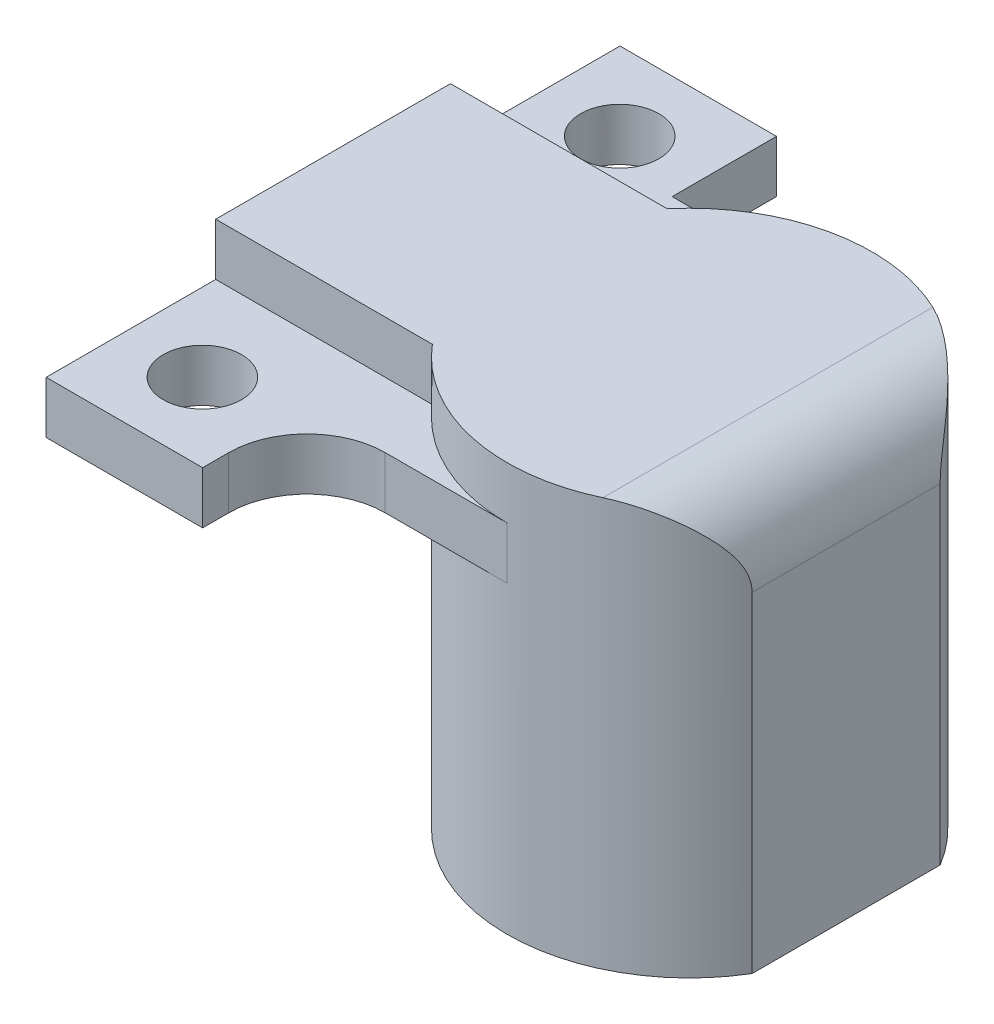
ISO-10303-21;
HEADER;
FILE_DESCRIPTION(('STEP AP214'),'2;1');
FILE_NAME('part.step','',(''),(''),'','','');
FILE_SCHEMA(('AUTOMOTIVE_DESIGN { 1 0 10303 214 1 1 1 1 }'));
ENDSEC;
DATA;
#1=APPLICATION_CONTEXT('core data for automotive mechanical design processes');
#2=APPLICATION_PROTOCOL_DEFINITION('international standard','automotive_design',2000,#1);
#3=PRODUCT_CONTEXT('',#1,'mechanical');
#4=PRODUCT('Part','Part','',(#3));
#5=PRODUCT_RELATED_PRODUCT_CATEGORY('part','',(#4));
#6=PRODUCT_DEFINITION_FORMATION('','',#4);
#7=PRODUCT_DEFINITION_CONTEXT('part definition',#1,'design');
#8=PRODUCT_DEFINITION('design','',#6,#7);
#9=PRODUCT_DEFINITION_SHAPE('','',#8);
#10=(LENGTH_UNIT() NAMED_UNIT(*) SI_UNIT(.MILLI.,.METRE.));
#11=(NAMED_UNIT(*) PLANE_ANGLE_UNIT() SI_UNIT($,.RADIAN.));
#12=(NAMED_UNIT(*) SI_UNIT($,.STERADIAN.) SOLID_ANGLE_UNIT());
#13=UNCERTAINTY_MEASURE_WITH_UNIT(LENGTH_MEASURE(1.E-05),#10,'distance_accuracy_value','');
#14=(GEOMETRIC_REPRESENTATION_CONTEXT(3) GLOBAL_UNCERTAINTY_ASSIGNED_CONTEXT((#13)) GLOBAL_UNIT_ASSIGNED_CONTEXT((#10,
#11,#12)) REPRESENTATION_CONTEXT('',''));
#15=CARTESIAN_POINT('',(0.,0.,0.));
#16=DIRECTION('',(0.,0.,1.));
#17=DIRECTION('',(1.,0.,0.));
#18=AXIS2_PLACEMENT_3D('',#15,#16,#17);
#19=CARTESIAN_POINT('',(0.,13.66,0.));
#20=DIRECTION('',(0.,1.,0.));
#21=DIRECTION('',(0.,0.,1.));
#22=AXIS2_PLACEMENT_3D('',#19,#20,#21);
#23=PLANE('',#22);
#24=CARTESIAN_POINT('',(-10.68,13.66,8.));
#25=DIRECTION('',(0.,1.,0.));
#26=DIRECTION('',(0.,0.,1.));
#27=AXIS2_PLACEMENT_3D('',#24,#25,#26);
#28=CIRCLE('',#27,1.5);
#29=CARTESIAN_POINT('',(-10.68,13.66,9.50000000000001));
#30=VERTEX_POINT('',#29);
#31=EDGE_CURVE('E191',#30,#30,#28,.T.);
#32=ORIENTED_EDGE('',*,*,#31,.F.);
#33=EDGE_LOOP('',(#32));
#34=FACE_BOUND('',#33,.T.);
#35=CARTESIAN_POINT('',(0.,13.66,0.));
#36=DIRECTION('',(0.,1.,0.));
#37=DIRECTION('',(0.,0.,1.));
#38=AXIS2_PLACEMENT_3D('',#35,#36,#37);
#39=CIRCLE('',#38,7.);
#40=CARTESIAN_POINT('',(-5.36190264738183,13.66,4.50000000000003));
#41=VERTEX_POINT('',#40);
#42=CARTESIAN_POINT('',(0.,13.66,7.));
#43=VERTEX_POINT('',#42);
#44=EDGE_CURVE('E489',#41,#43,#39,.T.);
#45=ORIENTED_EDGE('',*,*,#44,.F.);
#46=DIRECTION('',(1.,0.,0.));
#47=VECTOR('',#46,1.);
#48=CARTESIAN_POINT('',(-13.67,13.66,4.5));
#49=LINE('',#48,#47);
#50=CARTESIAN_POINT('',(-13.67,13.66,4.5));
#51=VERTEX_POINT('',#50);
#52=EDGE_CURVE('E552',#51,#41,#49,.T.);
#53=ORIENTED_EDGE('',*,*,#52,.F.);
#54=DIRECTION('',(0.,0.,-1.));
#55=VECTOR('',#54,1.);
#56=CARTESIAN_POINT('',(-13.67,13.66,0.));
#57=LINE('',#56,#55);
#58=CARTESIAN_POINT('',(-13.67,13.66,11.));
#59=VERTEX_POINT('',#58);
#60=EDGE_CURVE('E478',#59,#51,#57,.T.);
#61=ORIENTED_EDGE('',*,*,#60,.F.);
#62=DIRECTION('',(1.,0.,0.));
#63=VECTOR('',#62,1.);
#64=CARTESIAN_POINT('',(0.,13.66,11.));
#65=LINE('',#64,#63);
#66=CARTESIAN_POINT('',(-7.67,13.66,11.));
#67=VERTEX_POINT('',#66);
#68=EDGE_CURVE('E481',#59,#67,#65,.T.);
#69=ORIENTED_EDGE('',*,*,#68,.T.);
#70=DIRECTION('',(0.,0.,1.));
#71=VECTOR('',#70,1.);
#72=CARTESIAN_POINT('',(-7.67,13.66,0.));
#73=LINE('',#72,#71);
#74=CARTESIAN_POINT('',(-7.67,13.66,10.));
#75=VERTEX_POINT('',#74);
#76=EDGE_CURVE('E484',#75,#67,#73,.T.);
#77=ORIENTED_EDGE('',*,*,#76,.F.);
#78=CARTESIAN_POINT('',(-4.67,13.66,10.));
#79=DIRECTION('',(0.,1.,0.));
#80=DIRECTION('',(0.,0.,1.));
#81=AXIS2_PLACEMENT_3D('',#78,#79,#80);
#82=CIRCLE('',#81,3.);
#83=CARTESIAN_POINT('',(-4.67,13.66,7.));
#84=VERTEX_POINT('',#83);
#85=EDGE_CURVE('E201',#84,#75,#82,.T.);
#86=ORIENTED_EDGE('',*,*,#85,.F.);
#87=DIRECTION('',(1.,0.,0.));
#88=VECTOR('',#87,1.);
#89=CARTESIAN_POINT('',(0.,13.66,7.));
#90=LINE('',#89,#88);
#91=EDGE_CURVE('E486',#84,#43,#90,.T.);
#92=ORIENTED_EDGE('',*,*,#91,.T.);
#93=EDGE_LOOP('',(#45,#53,#61,#69,#77,#86,#92));
#94=FACE_BOUND('',#93,.T.);
#95=ADVANCED_FACE('F37',(#34,#94),#23,.T.);
#96=CARTESIAN_POINT('',(-10.68,13.66,-8.00000000000001));
#97=DIRECTION('',(0.,1.,0.));
#98=DIRECTION('',(0.,0.,1.));
#99=AXIS2_PLACEMENT_3D('',#96,#97,#98);
#100=CIRCLE('',#99,1.5);
#101=CARTESIAN_POINT('',(-10.68,13.66,-6.50000000000001));
#102=VERTEX_POINT('',#101);
#103=EDGE_CURVE('E194',#102,#102,#100,.F.);
#104=ORIENTED_EDGE('',*,*,#103,.T.);
#105=EDGE_LOOP('',(#104));
#106=FACE_BOUND('',#105,.T.);
#107=CARTESIAN_POINT('',(-13.67,13.66,-4.5));
#108=VERTEX_POINT('',#107);
#109=CARTESIAN_POINT('',(-13.67,13.66,-11.));
#110=VERTEX_POINT('',#109);
#111=EDGE_CURVE('E477',#108,#110,#57,.T.);
#112=ORIENTED_EDGE('',*,*,#111,.F.);
#113=DIRECTION('',(-1.,0.,0.));
#114=VECTOR('',#113,1.);
#115=CARTESIAN_POINT('',(-13.67,13.66,-4.5));
#116=LINE('',#115,#114);
#117=CARTESIAN_POINT('',(-5.36190264738185,13.66,-4.50000000000007));
#118=VERTEX_POINT('',#117);
#119=EDGE_CURVE('E553',#118,#108,#116,.T.);
#120=ORIENTED_EDGE('',*,*,#119,.F.);
#121=CARTESIAN_POINT('',(0.,13.66,-7.));
#122=VERTEX_POINT('',#121);
#123=EDGE_CURVE('E174',#122,#118,#39,.T.);
#124=ORIENTED_EDGE('',*,*,#123,.F.);
#125=DIRECTION('',(1.,0.,0.));
#126=VECTOR('',#125,1.);
#127=CARTESIAN_POINT('',(0.,13.66,-7.));
#128=LINE('',#127,#126);
#129=CARTESIAN_POINT('',(-7.67,13.66,-7.));
#130=VERTEX_POINT('',#129);
#131=EDGE_CURVE('E197',#130,#122,#128,.T.);
#132=ORIENTED_EDGE('',*,*,#131,.F.);
#133=DIRECTION('',(0.,0.,-1.));
#134=VECTOR('',#133,1.);
#135=CARTESIAN_POINT('',(-7.67,13.66,0.));
#136=LINE('',#135,#134);
#137=CARTESIAN_POINT('',(-7.67,13.66,-11.));
#138=VERTEX_POINT('',#137);
#139=EDGE_CURVE('E472',#130,#138,#136,.T.);
#140=ORIENTED_EDGE('',*,*,#139,.T.);
#141=DIRECTION('',(1.,0.,0.));
#142=VECTOR('',#141,1.);
#143=CARTESIAN_POINT('',(0.,13.66,-11.));
#144=LINE('',#143,#142);
#145=EDGE_CURVE('E474',#110,#138,#144,.T.);
#146=ORIENTED_EDGE('',*,*,#145,.F.);
#147=EDGE_LOOP('',(#112,#120,#124,#132,#140,#146));
#148=FACE_BOUND('',#147,.T.);
#149=ADVANCED_FACE('F215',(#106,#148),#23,.T.);
#150=CARTESIAN_POINT('',(0.,15.66,0.));
#151=DIRECTION('',(0.,-1.,0.));
#152=DIRECTION('',(0.,0.,-1.));
#153=AXIS2_PLACEMENT_3D('',#150,#151,#152);
#154=CYLINDRICAL_SURFACE('',#153,7.);
#155=DIRECTION('',(0.,-1.,0.));
#156=VECTOR('',#155,1.);
#157=CARTESIAN_POINT('',(-5.36190264738183,15.66,4.50000000000003));
#158=LINE('',#157,#156);
#159=CARTESIAN_POINT('',(-5.3619026473818,15.66,4.5));
#160=VERTEX_POINT('',#159);
#161=EDGE_CURVE('E58',#160,#41,#158,.T.);
#162=ORIENTED_EDGE('',*,*,#161,.T.);
#163=ORIENTED_EDGE('',*,*,#44,.T.);
#164=DIRECTION('',(0.,1.,0.));
#165=VECTOR('',#164,1.);
#166=CARTESIAN_POINT('',(0.,11.66,7.));
#167=LINE('',#166,#165);
#168=CARTESIAN_POINT('',(0.,11.66,7.));
#169=VERTEX_POINT('',#168);
#170=EDGE_CURVE('E508',#169,#43,#167,.T.);
#171=ORIENTED_EDGE('',*,*,#170,.F.);
#172=CARTESIAN_POINT('',(0.,11.66,0.));
#173=DIRECTION('',(0.,1.,0.));
#174=DIRECTION('',(0.,0.,1.));
#175=AXIS2_PLACEMENT_3D('',#172,#173,#174);
#176=CIRCLE('',#175,7.);
#177=CARTESIAN_POINT('',(0.,11.66,-7.));
#178=VERTEX_POINT('',#177);
#179=EDGE_CURVE('E497',#178,#169,#176,.T.);
#180=ORIENTED_EDGE('',*,*,#179,.F.);
#181=DIRECTION('',(0.,1.,0.));
#182=VECTOR('',#181,1.);
#183=CARTESIAN_POINT('',(0.,11.66,-7.));
#184=LINE('',#183,#182);
#185=EDGE_CURVE('E516',#178,#122,#184,.T.);
#186=ORIENTED_EDGE('',*,*,#185,.T.);
#187=ORIENTED_EDGE('',*,*,#123,.T.);
#188=DIRECTION('',(0.,-1.,0.));
#189=VECTOR('',#188,1.);
#190=CARTESIAN_POINT('',(-5.36190264738185,15.66,-4.50000000000007));
#191=LINE('',#190,#189);
#192=CARTESIAN_POINT('',(-5.36190264738185,15.66,-4.50000000000007));
#193=VERTEX_POINT('',#192);
#194=EDGE_CURVE('E159',#193,#118,#191,.T.);
#195=ORIENTED_EDGE('',*,*,#194,.F.);
#196=CARTESIAN_POINT('',(0.,15.66,0.));
#197=DIRECTION('',(0.,1.,0.));
#198=DIRECTION('',(0.,0.,1.));
#199=AXIS2_PLACEMENT_3D('',#196,#197,#198);
#200=CIRCLE('',#199,7.);
#201=CARTESIAN_POINT('',(3.00000000000003,15.66,-6.32455532033675));
#202=VERTEX_POINT('',#201);
#203=EDGE_CURVE('E172',#202,#193,#200,.T.);
#204=ORIENTED_EDGE('',*,*,#203,.F.);
#205=CARTESIAN_POINT('',(3.00000000000003,15.66,-6.32455532033675));
#206=CARTESIAN_POINT('',(3.09493653043601,15.6600046677572,-6.27954539564103));
#207=CARTESIAN_POINT('',(3.18878959130431,15.6554951840768,-6.23238730411597));
#208=CARTESIAN_POINT('',(3.3735772382066,15.6380919790941,-6.134315643579));
#209=CARTESIAN_POINT('',(3.46451523908464,15.6252084745325,-6.08340671779952));
#210=CARTESIAN_POINT('',(3.64220443721596,15.591839265947,-5.97870486558365));
#211=CARTESIAN_POINT('',(3.72898443678594,15.5714184758462,-5.92493982691222));
#212=CARTESIAN_POINT('',(3.89876515233543,15.5235647516884,-5.81462729508478));
#213=CARTESIAN_POINT('',(3.98176470137991,15.496129669538,-5.75807895384713));
#214=CARTESIAN_POINT('',(4.22375842258161,15.4044619441375,-5.58559691418396));
#215=CARTESIAN_POINT('',(4.37676935493854,15.3306630882142,-5.46621741916642));
#216=CARTESIAN_POINT('',(4.66576505836573,15.1606989396906,-5.22174647657742));
#217=CARTESIAN_POINT('',(4.80167971609713,15.0644458866592,-5.09663420591057));
#218=CARTESIAN_POINT('',(5.00461536945894,14.8941421508697,-4.89544307212083));
#219=CARTESIAN_POINT('',(5.07749680412401,14.8265430259163,-4.81970552571313));
#220=CARTESIAN_POINT('',(5.21656775729613,14.68404279828,-4.66882622569923));
#221=CARTESIAN_POINT('',(5.28275433322052,14.609138512935,-4.5936847473391));
#222=CARTESIAN_POINT('',(5.40799758497066,14.452097443981,-4.44555324562543));
#223=CARTESIAN_POINT('',(5.46707189913274,14.369979464197,-4.37255825397976));
#224=CARTESIAN_POINT('',(5.57782637693171,14.1979431659554,-4.23036114221015));
#225=CARTESIAN_POINT('',(5.62951346625119,14.1080322822817,-4.1611555075434));
#226=CARTESIAN_POINT('',(5.72301585438431,13.9231381242447,-4.03152950217135));
#227=CARTESIAN_POINT('',(5.76512858096801,13.8284713452523,-3.97087705211004));
#228=CARTESIAN_POINT('',(5.84066677543764,13.6304672895827,-3.85890673577066));
#229=CARTESIAN_POINT('',(5.8741020563137,13.527139983321,-3.80757834516448));
#230=CARTESIAN_POINT('',(5.92534256726129,13.3313176559775,-3.72722027291141));
#231=CARTESIAN_POINT('',(5.94488385845874,13.240265310895,-3.69583357672921));
#232=CARTESIAN_POINT('',(5.97558600517584,13.0534066209671,-3.64599167689169));
#233=CARTESIAN_POINT('',(5.98677280920469,12.957615989639,-3.62749644519796));
#234=CARTESIAN_POINT('',(5.99550866503187,12.8274882074117,-3.61301639017568));
#235=CARTESIAN_POINT('',(5.99718952397732,12.7940888866228,-3.61022470313571));
#236=CARTESIAN_POINT('',(5.9994353930432,12.7271313935653,-3.60649135061673));
#237=CARTESIAN_POINT('',(5.99999978771692,12.6935731438982,-3.60555070551907));
#238=CARTESIAN_POINT('',(6.00000000000002,12.66,-3.60555127546396));
#239=B_SPLINE_CURVE_WITH_KNOTS('',3,(#205,#206,#207,#208,#209,#210,#211,#212,#213,#214,#215,
#216,#217,#218,#219,#220,#221,#222,#223,#224,#225,#226,#227,#228,#229,#230,#231,#232,#233,#234,
#235,#236,#237,#238),.UNSPECIFIED.,.F.,.F.,(4,2,2,2,2,2,2,2,2,2,2,2,2,2,2,2,4),(0.,
0.314987755355557,0.629591928816344,0.941547537102512,1.25359879497099,1.87412118205294,
2.49711071296859,2.87167897645952,3.24641116454038,3.62019399283021,3.99362406006485,
4.3530554451295,4.71207857426867,5.00587307948295,5.2987512385273,5.39936845516224,
5.50004112121761),.UNSPECIFIED.);
#240=CARTESIAN_POINT('',(6.00000000000002,12.66,-3.60555127546396));
#241=VERTEX_POINT('',#240);
#242=EDGE_CURVE('E11',#202,#241,#239,.T.);
#243=ORIENTED_EDGE('',*,*,#242,.T.);
#244=DIRECTION('',(0.,-1.,0.));
#245=VECTOR('',#244,1.);
#246=CARTESIAN_POINT('',(6.00000000000002,15.661,-3.60555127546396));
#247=LINE('',#246,#245);
#248=CARTESIAN_POINT('',(6.00000000000002,0.,-3.60555127546396));
#249=VERTEX_POINT('',#248);
#250=EDGE_CURVE('E452',#241,#249,#247,.T.);
#251=ORIENTED_EDGE('',*,*,#250,.T.);
#252=CARTESIAN_POINT('',(0.,0.,0.));
#253=DIRECTION('',(0.,1.,0.));
#254=DIRECTION('',(0.,0.,1.));
#255=AXIS2_PLACEMENT_3D('',#252,#253,#254);
#256=CIRCLE('',#255,7.);
#257=CARTESIAN_POINT('',(5.99999999999999,0.,3.60555127546401));
#258=VERTEX_POINT('',#257);
#259=EDGE_CURVE('E184',#249,#258,#256,.T.);
#260=ORIENTED_EDGE('',*,*,#259,.T.);
#261=DIRECTION('',(0.,-1.,0.));
#262=VECTOR('',#261,1.);
#263=CARTESIAN_POINT('',(5.99999999999999,15.661,3.60555127546401));
#264=LINE('',#263,#262);
#265=CARTESIAN_POINT('',(5.99999999999999,12.66,3.60555127546401));
#266=VERTEX_POINT('',#265);
#267=EDGE_CURVE('E457',#266,#258,#264,.T.);
#268=ORIENTED_EDGE('',*,*,#267,.F.);
#269=CARTESIAN_POINT('',(5.99999999999999,12.66,3.60555127546401));
#270=CARTESIAN_POINT('',(6.00001070282223,12.7087497732982,3.60552478308489));
#271=CARTESIAN_POINT('',(5.99881214084997,12.7574826373458,3.6075278849052));
#272=CARTESIAN_POINT('',(5.99408162199084,12.8544495568724,3.6153869797712));
#273=CARTESIAN_POINT('',(5.99055326127023,12.9026842649262,3.62123703478625));
#274=CARTESIAN_POINT('',(5.98131258721386,12.997676486243,3.63647805156849));
#275=CARTESIAN_POINT('',(5.97563136583474,13.0444452162421,3.64581857794057));
#276=CARTESIAN_POINT('',(5.96221624542817,13.1369291206995,3.66771643756404));
#277=CARTESIAN_POINT('',(5.95448143875106,13.1826438195601,3.68027519313212));
#278=CARTESIAN_POINT('',(5.92265934395696,13.347731181071,3.73149003179929));
#279=CARTESIAN_POINT('',(5.89274746273465,13.463350271019,3.77884991397088));
#280=CARTESIAN_POINT('',(5.82189266332009,13.6850069398161,3.88712729712748));
#281=CARTESIAN_POINT('',(5.78087252440128,13.7909702293897,3.94813916570885));
#282=CARTESIAN_POINT('',(5.6973474079489,13.9763676471961,4.06751016473952));
#283=CARTESIAN_POINT('',(5.65624088133527,14.0572731430183,4.12460318543204));
#284=CARTESIAN_POINT('',(5.56829205146455,14.213024410379,4.2425863342132));
#285=CARTESIAN_POINT('',(5.52144597596116,14.2878661423297,4.30347894649676));
#286=CARTESIAN_POINT('',(5.4224247477594,14.4318606505696,4.4275973665208));
#287=CARTESIAN_POINT('',(5.37024900217347,14.5010127923844,4.49082343334058));
#288=CARTESIAN_POINT('',(5.260815025734,14.6338588922982,4.61853865378555));
#289=CARTESIAN_POINT('',(5.20355791822367,14.6975540506902,4.68302752579609));
#290=CARTESIAN_POINT('',(5.08022130490414,14.8235488832775,4.81665229639004));
#291=CARTESIAN_POINT('',(5.01381081128065,14.8854925723857,4.88581926027849));
#292=CARTESIAN_POINT('',(4.87547859132384,15.0032521067172,5.02387070075586));
#293=CARTESIAN_POINT('',(4.80355517691789,15.0590660621678,5.09275508396068));
#294=CARTESIAN_POINT('',(4.57971795814075,15.2169213749332,5.29783258406104));
#295=CARTESIAN_POINT('',(4.41959486605551,15.3095220210697,5.43260713284095));
#296=CARTESIAN_POINT('',(4.0934833939113,15.4588460497521,5.68170125324272));
#297=CARTESIAN_POINT('',(3.92919870693861,15.5179789273254,5.79678191110659));
#298=CARTESIAN_POINT('',(3.67191370674713,15.5851279070143,5.96048710071104));
#299=CARTESIAN_POINT('',(3.58443112107215,15.603911487536,6.01352310610383));
#300=CARTESIAN_POINT('',(3.40624684689613,15.6337364558233,6.11620985018356));
#301=CARTESIAN_POINT('',(3.31554755708179,15.6447834902715,6.16586303394968));
#302=CARTESIAN_POINT('',(3.18668558682459,15.654414518497,6.23271749545191));
#303=CARTESIAN_POINT('',(3.14959553548258,15.6565001995147,6.25154230461803));
#304=CARTESIAN_POINT('',(3.07505872312343,15.6592925309499,6.2885406042851));
#305=CARTESIAN_POINT('',(3.0376121059519,15.659999715612,6.30671434443014));
#306=CARTESIAN_POINT('',(2.99999999999998,15.66,6.32455532033677));
#307=B_SPLINE_CURVE_WITH_KNOTS('',3,(#269,#270,#271,#272,#273,#274,#275,#276,#277,#278,#279,
#280,#281,#282,#283,#284,#285,#286,#287,#288,#289,#290,#291,#292,#293,#294,#295,#296,#297,#298,
#299,#300,#301,#302,#303,#304,#305,#306),.UNSPECIFIED.,.F.,.F.,(4,2,2,2,2,2,2,2,2,2,2,2,2,2,2,2,
2,2,4),(0.,0.146166225733025,0.292107362008318,0.436016507923602,0.579989365417853,
0.963057331576762,1.34885982567561,1.67006905983176,1.99149054874022,2.31294783250362,
2.63433422748046,2.97648307579034,3.3187371128607,4.00248050624863,4.62711545307778,
4.93883788920374,5.25033257029745,5.37524714255534,5.50011329378779),.UNSPECIFIED.);
#308=CARTESIAN_POINT('',(2.99999999999997,15.66,6.32455532033677));
#309=VERTEX_POINT('',#308);
#310=EDGE_CURVE('E51',#266,#309,#307,.T.);
#311=ORIENTED_EDGE('',*,*,#310,.T.);
#312=EDGE_CURVE('E65',#160,#309,#200,.T.);
#313=ORIENTED_EDGE('',*,*,#312,.F.);
#314=EDGE_LOOP('',(#162,#163,#171,#180,#186,#187,#195,#204,#243,#251,#260,#268,#311,#313));
#315=FACE_BOUND('',#314,.T.);
#316=ADVANCED_FACE('F171',(#315),#154,.T.);
#317=CARTESIAN_POINT('',(3.00000000000001,12.66,-3.60555127546398));
#318=DIRECTION('',(0.,0.,-1.));
#319=DIRECTION('',(-1.,0.,0.));
#320=AXIS2_PLACEMENT_3D('',#317,#318,#319);
#321=CYLINDRICAL_SURFACE('',#320,3.);
#322=DIRECTION('',(0.,0.,1.));
#323=VECTOR('',#322,1.);
#324=CARTESIAN_POINT('',(6.00000000000002,12.66,-3.60555127546396));
#325=LINE('',#324,#323);
#326=EDGE_CURVE('E205',#241,#266,#325,.T.);
#327=ORIENTED_EDGE('',*,*,#326,.F.);
#328=ORIENTED_EDGE('',*,*,#242,.F.);
#329=DIRECTION('',(0.,0.,1.));
#330=VECTOR('',#329,1.);
#331=CARTESIAN_POINT('',(3.00000000000001,15.66,-3.60555127546398));
#332=LINE('',#331,#330);
#333=EDGE_CURVE('E178',#309,#202,#332,.F.);
#334=ORIENTED_EDGE('',*,*,#333,.F.);
#335=ORIENTED_EDGE('',*,*,#310,.F.);
#336=EDGE_LOOP('',(#327,#328,#334,#335));
#337=FACE_BOUND('',#336,.T.);
#338=ADVANCED_FACE('F39',(#337),#321,.T.);
#339=CARTESIAN_POINT('',(0.,15.66,0.));
#340=DIRECTION('',(0.,-1.,0.));
#341=DIRECTION('',(0.,0.,-1.));
#342=AXIS2_PLACEMENT_3D('',#339,#340,#341);
#343=CYLINDRICAL_SURFACE('',#342,5.2);
#344=CARTESIAN_POINT('',(0.,0.,0.));
#345=DIRECTION('',(0.,1.,0.));
#346=DIRECTION('',(0.,0.,1.));
#347=AXIS2_PLACEMENT_3D('',#344,#345,#346);
#348=CIRCLE('',#347,5.2);
#349=CARTESIAN_POINT('',(0.,0.,5.2));
#350=VERTEX_POINT('',#349);
#351=EDGE_CURVE('E187',#350,#350,#348,.T.);
#352=ORIENTED_EDGE('',*,*,#351,.F.);
#353=EDGE_LOOP('',(#352));
#354=FACE_BOUND('',#353,.T.);
#355=CARTESIAN_POINT('',(0.,14.66,0.));
#356=DIRECTION('',(0.,1.,0.));
#357=DIRECTION('',(0.,0.,1.));
#358=AXIS2_PLACEMENT_3D('',#355,#356,#357);
#359=CIRCLE('',#358,5.2);
#360=CARTESIAN_POINT('',(0.,14.66,5.2));
#361=VERTEX_POINT('',#360);
#362=EDGE_CURVE('E456',#361,#361,#359,.T.);
#363=ORIENTED_EDGE('',*,*,#362,.T.);
#364=EDGE_LOOP('',(#363));
#365=FACE_BOUND('',#364,.T.);
#366=ADVANCED_FACE('F222',(#354,#365),#343,.F.);
#367=CARTESIAN_POINT('',(-4.67,11.66,10.));
#368=DIRECTION('',(0.,-1.,0.));
#369=DIRECTION('',(0.,0.,-1.));
#370=AXIS2_PLACEMENT_3D('',#367,#368,#369);
#371=CYLINDRICAL_SURFACE('',#370,3.);
#372=DIRECTION('',(0.,-1.,0.));
#373=VECTOR('',#372,1.);
#374=CARTESIAN_POINT('',(-4.67,11.66,7.));
#375=LINE('',#374,#373);
#376=CARTESIAN_POINT('',(-4.67,11.66,7.));
#377=VERTEX_POINT('',#376);
#378=EDGE_CURVE('E179',#84,#377,#375,.T.);
#379=ORIENTED_EDGE('',*,*,#378,.F.);
#380=ORIENTED_EDGE('',*,*,#85,.T.);
#381=DIRECTION('',(0.,-1.,0.));
#382=VECTOR('',#381,1.);
#383=CARTESIAN_POINT('',(-7.67,11.66,10.));
#384=LINE('',#383,#382);
#385=CARTESIAN_POINT('',(-7.67,11.66,10.));
#386=VERTEX_POINT('',#385);
#387=EDGE_CURVE('E182',#386,#75,#384,.F.);
#388=ORIENTED_EDGE('',*,*,#387,.F.);
#389=CARTESIAN_POINT('',(-4.67,11.66,10.));
#390=DIRECTION('',(0.,1.,0.));
#391=DIRECTION('',(0.,0.,1.));
#392=AXIS2_PLACEMENT_3D('',#389,#390,#391);
#393=CIRCLE('',#392,3.);
#394=EDGE_CURVE('E203',#386,#377,#393,.F.);
#395=ORIENTED_EDGE('',*,*,#394,.T.);
#396=EDGE_LOOP('',(#379,#380,#388,#395));
#397=FACE_BOUND('',#396,.T.);
#398=ADVANCED_FACE('F218',(#397),#371,.F.);
#399=CARTESIAN_POINT('',(0.,11.66,0.));
#400=DIRECTION('',(0.,1.,0.));
#401=DIRECTION('',(0.,0.,1.));
#402=AXIS2_PLACEMENT_3D('',#399,#400,#401);
#403=PLANE('',#402);
#404=ORIENTED_EDGE('',*,*,#394,.F.);
#405=DIRECTION('',(0.,0.,1.));
#406=VECTOR('',#405,1.);
#407=CARTESIAN_POINT('',(-7.67,11.66,0.));
#408=LINE('',#407,#406);
#409=CARTESIAN_POINT('',(-7.67,11.66,11.));
#410=VERTEX_POINT('',#409);
#411=EDGE_CURVE('E492',#386,#410,#408,.T.);
#412=ORIENTED_EDGE('',*,*,#411,.T.);
#413=DIRECTION('',(1.,0.,0.));
#414=VECTOR('',#413,1.);
#415=CARTESIAN_POINT('',(0.,11.66,11.));
#416=LINE('',#415,#414);
#417=CARTESIAN_POINT('',(-13.67,11.66,11.));
#418=VERTEX_POINT('',#417);
#419=EDGE_CURVE('E505',#418,#410,#416,.T.);
#420=ORIENTED_EDGE('',*,*,#419,.F.);
#421=DIRECTION('',(0.,0.,1.));
#422=VECTOR('',#421,1.);
#423=CARTESIAN_POINT('',(-13.67,11.66,0.));
#424=LINE('',#423,#422);
#425=CARTESIAN_POINT('',(-13.67,11.66,-11.));
#426=VERTEX_POINT('',#425);
#427=EDGE_CURVE('E502',#426,#418,#424,.T.);
#428=ORIENTED_EDGE('',*,*,#427,.F.);
#429=DIRECTION('',(1.,0.,0.));
#430=VECTOR('',#429,1.);
#431=CARTESIAN_POINT('',(-13.67,11.66,-11.));
#432=LINE('',#431,#430);
#433=CARTESIAN_POINT('',(-7.67,11.66,-11.));
#434=VERTEX_POINT('',#433);
#435=EDGE_CURVE('E491',#426,#434,#432,.T.);
#436=ORIENTED_EDGE('',*,*,#435,.T.);
#437=DIRECTION('',(0.,0.,-1.));
#438=VECTOR('',#437,1.);
#439=CARTESIAN_POINT('',(-7.67,11.66,-7.));
#440=LINE('',#439,#438);
#441=CARTESIAN_POINT('',(-7.67,11.66,-7.));
#442=VERTEX_POINT('',#441);
#443=EDGE_CURVE('E523',#442,#434,#440,.T.);
#444=ORIENTED_EDGE('',*,*,#443,.F.);
#445=DIRECTION('',(1.,0.,0.));
#446=VECTOR('',#445,1.);
#447=CARTESIAN_POINT('',(0.,11.66,-7.));
#448=LINE('',#447,#446);
#449=EDGE_CURVE('E500',#442,#178,#448,.T.);
#450=ORIENTED_EDGE('',*,*,#449,.T.);
#451=ORIENTED_EDGE('',*,*,#179,.T.);
#452=DIRECTION('',(1.,0.,0.));
#453=VECTOR('',#452,1.);
#454=CARTESIAN_POINT('',(0.,11.66,7.));
#455=LINE('',#454,#453);
#456=EDGE_CURVE('E494',#377,#169,#455,.T.);
#457=ORIENTED_EDGE('',*,*,#456,.F.);
#458=EDGE_LOOP('',(#404,#412,#420,#428,#436,#444,#450,#451,#457));
#459=FACE_BOUND('',#458,.T.);
#460=CARTESIAN_POINT('',(-10.68,11.66,8.));
#461=DIRECTION('',(0.,-1.,0.));
#462=DIRECTION('',(0.,0.,-1.));
#463=AXIS2_PLACEMENT_3D('',#460,#461,#462);
#464=CIRCLE('',#463,1.5);
#465=CARTESIAN_POINT('',(-10.68,11.66,6.5));
#466=VERTEX_POINT('',#465);
#467=EDGE_CURVE('E460',#466,#466,#464,.T.);
#468=ORIENTED_EDGE('',*,*,#467,.F.);
#469=EDGE_LOOP('',(#468));
#470=FACE_BOUND('',#469,.T.);
#471=CARTESIAN_POINT('',(-10.68,11.66,-8.00000000000001));
#472=DIRECTION('',(0.,-1.,0.));
#473=DIRECTION('',(0.,0.,-1.));
#474=AXIS2_PLACEMENT_3D('',#471,#472,#473);
#475=CIRCLE('',#474,1.5);
#476=CARTESIAN_POINT('',(-10.68,11.66,-9.50000000000001));
#477=VERTEX_POINT('',#476);
#478=EDGE_CURVE('E195',#477,#477,#475,.F.);
#479=ORIENTED_EDGE('',*,*,#478,.T.);
#480=EDGE_LOOP('',(#479));
#481=FACE_BOUND('',#480,.T.);
#482=ADVANCED_FACE('F221',(#459,#470,#481),#403,.F.);
#483=CARTESIAN_POINT('',(0.,15.66,0.));
#484=DIRECTION('',(0.,1.,0.));
#485=DIRECTION('',(0.,0.,1.));
#486=AXIS2_PLACEMENT_3D('',#483,#484,#485);
#487=PLANE('',#486);
#488=ORIENTED_EDGE('',*,*,#203,.T.);
#489=DIRECTION('',(-1.,0.,0.));
#490=VECTOR('',#489,1.);
#491=CARTESIAN_POINT('',(-13.67,15.66,-4.5));
#492=LINE('',#491,#490);
#493=CARTESIAN_POINT('',(-13.67,15.66,-4.5));
#494=VERTEX_POINT('',#493);
#495=EDGE_CURVE('E156',#193,#494,#492,.T.);
#496=ORIENTED_EDGE('',*,*,#495,.T.);
#497=DIRECTION('',(0.,0.,1.));
#498=VECTOR('',#497,1.);
#499=CARTESIAN_POINT('',(-13.67,15.66,-4.5));
#500=LINE('',#499,#498);
#501=CARTESIAN_POINT('',(-13.67,15.66,4.5));
#502=VERTEX_POINT('',#501);
#503=EDGE_CURVE('E165',#494,#502,#500,.T.);
#504=ORIENTED_EDGE('',*,*,#503,.T.);
#505=DIRECTION('',(1.,0.,0.));
#506=VECTOR('',#505,1.);
#507=CARTESIAN_POINT('',(-13.67,15.66,4.5));
#508=LINE('',#507,#506);
#509=EDGE_CURVE('E166',#502,#160,#508,.T.);
#510=ORIENTED_EDGE('',*,*,#509,.T.);
#511=ORIENTED_EDGE('',*,*,#312,.T.);
#512=ORIENTED_EDGE('',*,*,#333,.T.);
#513=EDGE_LOOP('',(#488,#496,#504,#510,#511,#512));
#514=FACE_BOUND('',#513,.T.);
#515=ADVANCED_FACE('F176',(#514),#487,.T.);
#516=CARTESIAN_POINT('',(-7.67,11.66,0.));
#517=DIRECTION('',(-1.,0.,0.));
#518=DIRECTION('',(0.,0.,1.));
#519=AXIS2_PLACEMENT_3D('',#516,#517,#518);
#520=PLANE('',#519);
#521=ORIENTED_EDGE('',*,*,#411,.F.);
#522=ORIENTED_EDGE('',*,*,#387,.T.);
#523=ORIENTED_EDGE('',*,*,#76,.T.);
#524=DIRECTION('',(0.,1.,0.));
#525=VECTOR('',#524,1.);
#526=CARTESIAN_POINT('',(-7.67,11.66,11.));
#527=LINE('',#526,#525);
#528=EDGE_CURVE('E509',#410,#67,#527,.T.);
#529=ORIENTED_EDGE('',*,*,#528,.F.);
#530=EDGE_LOOP('',(#521,#522,#523,#529));
#531=FACE_BOUND('',#530,.T.);
#532=ADVANCED_FACE('F250',(#531),#520,.F.);
#533=CARTESIAN_POINT('',(0.,11.66,11.));
#534=DIRECTION('',(0.,0.,1.));
#535=DIRECTION('',(1.,0.,0.));
#536=AXIS2_PLACEMENT_3D('',#533,#534,#535);
#537=PLANE('',#536);
#538=ORIENTED_EDGE('',*,*,#528,.T.);
#539=ORIENTED_EDGE('',*,*,#68,.F.);
#540=DIRECTION('',(0.,1.,0.));
#541=VECTOR('',#540,1.);
#542=CARTESIAN_POINT('',(-13.67,11.66,11.));
#543=LINE('',#542,#541);
#544=EDGE_CURVE('E513',#418,#59,#543,.T.);
#545=ORIENTED_EDGE('',*,*,#544,.F.);
#546=ORIENTED_EDGE('',*,*,#419,.T.);
#547=EDGE_LOOP('',(#538,#539,#545,#546));
#548=FACE_BOUND('',#547,.T.);
#549=ADVANCED_FACE('F246',(#548),#537,.T.);
#550=CARTESIAN_POINT('',(-13.67,11.66,0.));
#551=DIRECTION('',(-1.,0.,0.));
#552=DIRECTION('',(0.,0.,1.));
#553=AXIS2_PLACEMENT_3D('',#550,#551,#552);
#554=PLANE('',#553);
#555=ORIENTED_EDGE('',*,*,#544,.T.);
#556=ORIENTED_EDGE('',*,*,#60,.T.);
#557=DIRECTION('',(0.,-1.,0.));
#558=VECTOR('',#557,1.);
#559=CARTESIAN_POINT('',(-13.67,15.66,4.5));
#560=LINE('',#559,#558);
#561=EDGE_CURVE('E548',#502,#51,#560,.T.);
#562=ORIENTED_EDGE('',*,*,#561,.F.);
#563=ORIENTED_EDGE('',*,*,#503,.F.);
#564=DIRECTION('',(0.,-1.,0.));
#565=VECTOR('',#564,1.);
#566=CARTESIAN_POINT('',(-13.67,15.66,-4.5));
#567=LINE('',#566,#565);
#568=EDGE_CURVE('E162',#494,#108,#567,.T.);
#569=ORIENTED_EDGE('',*,*,#568,.T.);
#570=ORIENTED_EDGE('',*,*,#111,.T.);
#571=DIRECTION('',(0.,1.,0.));
#572=VECTOR('',#571,1.);
#573=CARTESIAN_POINT('',(-13.67,11.66,-11.));
#574=LINE('',#573,#572);
#575=EDGE_CURVE('E495',#426,#110,#574,.T.);
#576=ORIENTED_EDGE('',*,*,#575,.F.);
#577=ORIENTED_EDGE('',*,*,#427,.T.);
#578=EDGE_LOOP('',(#555,#556,#562,#563,#569,#570,#576,#577));
#579=FACE_BOUND('',#578,.T.);
#580=ADVANCED_FACE('F249',(#579),#554,.T.);
#581=CARTESIAN_POINT('',(0.,11.66,-7.));
#582=DIRECTION('',(0.,0.,1.));
#583=DIRECTION('',(1.,0.,0.));
#584=AXIS2_PLACEMENT_3D('',#581,#582,#583);
#585=PLANE('',#584);
#586=ORIENTED_EDGE('',*,*,#131,.T.);
#587=ORIENTED_EDGE('',*,*,#185,.F.);
#588=ORIENTED_EDGE('',*,*,#449,.F.);
#589=DIRECTION('',(0.,1.,0.));
#590=VECTOR('',#589,1.);
#591=CARTESIAN_POINT('',(-7.67,11.66,-7.));
#592=LINE('',#591,#590);
#593=EDGE_CURVE('E512',#442,#130,#592,.T.);
#594=ORIENTED_EDGE('',*,*,#593,.T.);
#595=EDGE_LOOP('',(#586,#587,#588,#594));
#596=FACE_BOUND('',#595,.T.);
#597=ADVANCED_FACE('F254',(#596),#585,.F.);
#598=CARTESIAN_POINT('',(0.,11.66,7.));
#599=DIRECTION('',(0.,0.,1.));
#600=DIRECTION('',(1.,0.,0.));
#601=AXIS2_PLACEMENT_3D('',#598,#599,#600);
#602=PLANE('',#601);
#603=ORIENTED_EDGE('',*,*,#91,.F.);
#604=ORIENTED_EDGE('',*,*,#378,.T.);
#605=ORIENTED_EDGE('',*,*,#456,.T.);
#606=ORIENTED_EDGE('',*,*,#170,.T.);
#607=EDGE_LOOP('',(#603,#604,#605,#606));
#608=FACE_BOUND('',#607,.T.);
#609=ADVANCED_FACE('F258',(#608),#602,.T.);
#610=CARTESIAN_POINT('',(-13.67,11.66,-11.));
#611=DIRECTION('',(0.,0.,1.));
#612=DIRECTION('',(1.,0.,0.));
#613=AXIS2_PLACEMENT_3D('',#610,#611,#612);
#614=PLANE('',#613);
#615=ORIENTED_EDGE('',*,*,#145,.T.);
#616=DIRECTION('',(0.,1.,0.));
#617=VECTOR('',#616,1.);
#618=CARTESIAN_POINT('',(-7.67,11.66,-11.));
#619=LINE('',#618,#617);
#620=EDGE_CURVE('E526',#434,#138,#619,.T.);
#621=ORIENTED_EDGE('',*,*,#620,.F.);
#622=ORIENTED_EDGE('',*,*,#435,.F.);
#623=ORIENTED_EDGE('',*,*,#575,.T.);
#624=EDGE_LOOP('',(#615,#621,#622,#623));
#625=FACE_BOUND('',#624,.T.);
#626=ADVANCED_FACE('F262',(#625),#614,.F.);
#627=CARTESIAN_POINT('',(-7.67,11.66,-7.));
#628=DIRECTION('',(1.,0.,0.));
#629=DIRECTION('',(0.,0.,-1.));
#630=AXIS2_PLACEMENT_3D('',#627,#628,#629);
#631=PLANE('',#630);
#632=ORIENTED_EDGE('',*,*,#620,.T.);
#633=ORIENTED_EDGE('',*,*,#139,.F.);
#634=ORIENTED_EDGE('',*,*,#593,.F.);
#635=ORIENTED_EDGE('',*,*,#443,.T.);
#636=EDGE_LOOP('',(#632,#633,#634,#635));
#637=FACE_BOUND('',#636,.T.);
#638=ADVANCED_FACE('F267',(#637),#631,.T.);
#639=CARTESIAN_POINT('',(0.,0.,0.));
#640=DIRECTION('',(0.,1.,0.));
#641=DIRECTION('',(0.,0.,1.));
#642=AXIS2_PLACEMENT_3D('',#639,#640,#641);
#643=PLANE('',#642);
#644=ORIENTED_EDGE('',*,*,#259,.F.);
#645=DIRECTION('',(0.,0.,-1.));
#646=VECTOR('',#645,1.);
#647=CARTESIAN_POINT('',(6.00000000000002,0.,-3.60555127546396));
#648=LINE('',#647,#646);
#649=EDGE_CURVE('E454',#258,#249,#648,.T.);
#650=ORIENTED_EDGE('',*,*,#649,.F.);
#651=EDGE_LOOP('',(#644,#650));
#652=FACE_BOUND('',#651,.T.);
#653=ORIENTED_EDGE('',*,*,#351,.T.);
#654=EDGE_LOOP('',(#653));
#655=FACE_BOUND('',#654,.T.);
#656=ADVANCED_FACE('F216',(#652,#655),#643,.F.);
#657=CARTESIAN_POINT('',(-10.68,21.66,8.));
#658=DIRECTION('',(0.,-1.,0.));
#659=DIRECTION('',(0.,0.,-1.));
#660=AXIS2_PLACEMENT_3D('',#657,#658,#659);
#661=CYLINDRICAL_SURFACE('',#660,1.5);
#662=ORIENTED_EDGE('',*,*,#31,.T.);
#663=EDGE_LOOP('',(#662));
#664=FACE_BOUND('',#663,.T.);
#665=ORIENTED_EDGE('',*,*,#467,.T.);
#666=EDGE_LOOP('',(#665));
#667=FACE_BOUND('',#666,.T.);
#668=ADVANCED_FACE('F243',(#664,#667),#661,.F.);
#669=CARTESIAN_POINT('',(-10.68,21.66,-8.00000000000001));
#670=DIRECTION('',(0.,-1.,0.));
#671=DIRECTION('',(0.,0.,-1.));
#672=AXIS2_PLACEMENT_3D('',#669,#670,#671);
#673=CYLINDRICAL_SURFACE('',#672,1.5);
#674=ORIENTED_EDGE('',*,*,#103,.F.);
#675=EDGE_LOOP('',(#674));
#676=FACE_BOUND('',#675,.T.);
#677=ORIENTED_EDGE('',*,*,#478,.F.);
#678=EDGE_LOOP('',(#677));
#679=FACE_BOUND('',#678,.T.);
#680=ADVANCED_FACE('F323',(#676,#679),#673,.F.);
#681=CARTESIAN_POINT('',(0.,14.66,0.));
#682=DIRECTION('',(0.,1.,0.));
#683=DIRECTION('',(0.,0.,1.));
#684=AXIS2_PLACEMENT_3D('',#681,#682,#683);
#685=PLANE('',#684);
#686=ORIENTED_EDGE('',*,*,#362,.F.);
#687=EDGE_LOOP('',(#686));
#688=FACE_BOUND('',#687,.T.);
#689=ADVANCED_FACE('F330',(#688),#685,.F.);
#690=CARTESIAN_POINT('',(6.00000000000002,15.661,-3.60555127546396));
#691=DIRECTION('',(-1.,0.,0.));
#692=DIRECTION('',(0.,0.,1.));
#693=AXIS2_PLACEMENT_3D('',#690,#691,#692);
#694=PLANE('',#693);
#695=ORIENTED_EDGE('',*,*,#250,.F.);
#696=ORIENTED_EDGE('',*,*,#326,.T.);
#697=ORIENTED_EDGE('',*,*,#267,.T.);
#698=ORIENTED_EDGE('',*,*,#649,.T.);
#699=EDGE_LOOP('',(#695,#696,#697,#698));
#700=FACE_BOUND('',#699,.T.);
#701=ADVANCED_FACE('F336',(#700),#694,.F.);
#702=CARTESIAN_POINT('',(-13.67,15.66,4.5));
#703=DIRECTION('',(0.,0.,-1.));
#704=DIRECTION('',(-1.,0.,0.));
#705=AXIS2_PLACEMENT_3D('',#702,#703,#704);
#706=PLANE('',#705);
#707=ORIENTED_EDGE('',*,*,#52,.T.);
#708=ORIENTED_EDGE('',*,*,#161,.F.);
#709=ORIENTED_EDGE('',*,*,#509,.F.);
#710=ORIENTED_EDGE('',*,*,#561,.T.);
#711=EDGE_LOOP('',(#707,#708,#709,#710));
#712=FACE_BOUND('',#711,.T.);
#713=ADVANCED_FACE('F344',(#712),#706,.F.);
#714=CARTESIAN_POINT('',(-13.67,15.66,-4.5));
#715=DIRECTION('',(0.,0.,1.));
#716=DIRECTION('',(1.,0.,0.));
#717=AXIS2_PLACEMENT_3D('',#714,#715,#716);
#718=PLANE('',#717);
#719=ORIENTED_EDGE('',*,*,#119,.T.);
#720=ORIENTED_EDGE('',*,*,#568,.F.);
#721=ORIENTED_EDGE('',*,*,#495,.F.);
#722=ORIENTED_EDGE('',*,*,#194,.T.);
#723=EDGE_LOOP('',(#719,#720,#721,#722));
#724=FACE_BOUND('',#723,.T.);
#725=ADVANCED_FACE('F158',(#724),#718,.F.);
#726=CLOSED_SHELL('',(#95,#149,#316,#338,#366,#398,#482,#515,#532,#549,#580,#597,#609,#626,#638,
#656,#668,#680,#689,#701,#713,#725));
#727=MANIFOLD_SOLID_BREP('B2',#726);
#728=ADVANCED_BREP_SHAPE_REPRESENTATION('',(#18,#727),#14);
#729=SHAPE_DEFINITION_REPRESENTATION(#9,#728);
ENDSEC;
END-ISO-10303-21;
